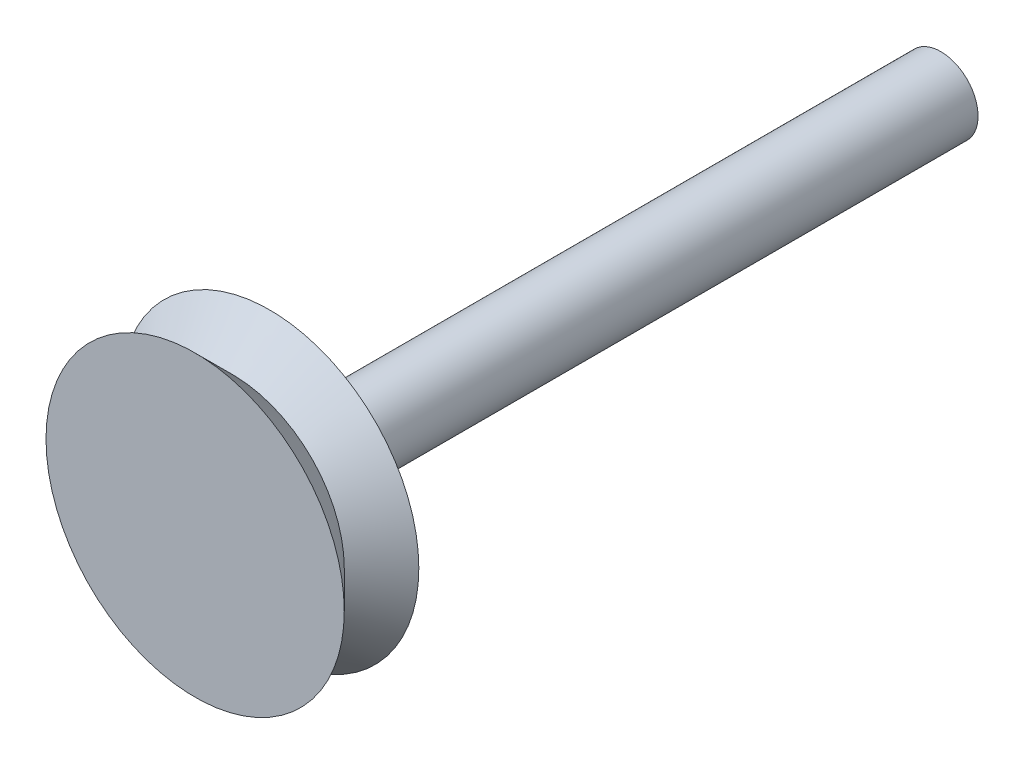
ISO-10303-21;
HEADER;
FILE_DESCRIPTION(('STEP AP214'),'2;1');
FILE_NAME('part.step','',(''),(''),'','','');
FILE_SCHEMA(('AUTOMOTIVE_DESIGN { 1 0 10303 214 1 1 1 1 }'));
ENDSEC;
DATA;
#1=APPLICATION_CONTEXT('core data for automotive mechanical design processes');
#2=APPLICATION_PROTOCOL_DEFINITION('international standard','automotive_design',2000,#1);
#3=PRODUCT_CONTEXT('',#1,'mechanical');
#4=PRODUCT('Part','Part','',(#3));
#5=PRODUCT_RELATED_PRODUCT_CATEGORY('part','',(#4));
#6=PRODUCT_DEFINITION_FORMATION('','',#4);
#7=PRODUCT_DEFINITION_CONTEXT('part definition',#1,'design');
#8=PRODUCT_DEFINITION('design','',#6,#7);
#9=PRODUCT_DEFINITION_SHAPE('','',#8);
#10=(LENGTH_UNIT() NAMED_UNIT(*) SI_UNIT(.MILLI.,.METRE.));
#11=(NAMED_UNIT(*) PLANE_ANGLE_UNIT() SI_UNIT($,.RADIAN.));
#12=(NAMED_UNIT(*) SI_UNIT($,.STERADIAN.) SOLID_ANGLE_UNIT());
#13=UNCERTAINTY_MEASURE_WITH_UNIT(LENGTH_MEASURE(1.E-05),#10,'distance_accuracy_value','');
#14=(GEOMETRIC_REPRESENTATION_CONTEXT(3) GLOBAL_UNCERTAINTY_ASSIGNED_CONTEXT((#13)) GLOBAL_UNIT_ASSIGNED_CONTEXT((#10,
#11,#12)) REPRESENTATION_CONTEXT('',''));
#15=CARTESIAN_POINT('',(0.,0.,0.));
#16=DIRECTION('',(0.,0.,1.));
#17=DIRECTION('',(1.,0.,0.));
#18=AXIS2_PLACEMENT_3D('',#15,#16,#17);
#19=CARTESIAN_POINT('',(0.,0.,0.));
#20=DIRECTION('',(0.,0.,1.));
#21=DIRECTION('',(1.,0.,0.));
#22=AXIS2_PLACEMENT_3D('',#19,#20,#21);
#23=PLANE('',#22);
#24=CARTESIAN_POINT('',(0.,0.,0.));
#25=DIRECTION('',(0.,0.,-1.));
#26=DIRECTION('',(-1.,0.,0.));
#27=AXIS2_PLACEMENT_3D('',#24,#25,#26);
#28=CIRCLE('',#27,1.);
#29=CARTESIAN_POINT('',(-1.,0.,0.));
#30=VERTEX_POINT('',#29);
#31=EDGE_CURVE('E10',#30,#30,#28,.T.);
#32=ORIENTED_EDGE('',*,*,#31,.F.);
#33=EDGE_LOOP('',(#32));
#34=FACE_BOUND('',#33,.T.);
#35=CARTESIAN_POINT('',(0.,0.,0.));
#36=DIRECTION('',(0.,0.,1.));
#37=DIRECTION('',(1.,0.,0.));
#38=AXIS2_PLACEMENT_3D('',#35,#36,#37);
#39=CIRCLE('',#38,4.);
#40=CARTESIAN_POINT('',(4.,0.,0.));
#41=VERTEX_POINT('',#40);
#42=EDGE_CURVE('E51',#41,#41,#39,.T.);
#43=ORIENTED_EDGE('',*,*,#42,.F.);
#44=EDGE_LOOP('',(#43));
#45=FACE_BOUND('',#44,.T.);
#46=ADVANCED_FACE('F32',(#34,#45),#23,.F.);
#47=CARTESIAN_POINT('',(0.,0.,-18.));
#48=DIRECTION('',(0.,0.,1.));
#49=DIRECTION('',(1.,0.,0.));
#50=AXIS2_PLACEMENT_3D('',#47,#48,#49);
#51=CYLINDRICAL_SURFACE('',#50,1.);
#52=CARTESIAN_POINT('',(0.,0.,-18.));
#53=DIRECTION('',(0.,0.,-1.));
#54=DIRECTION('',(-1.,0.,0.));
#55=AXIS2_PLACEMENT_3D('',#52,#53,#54);
#56=CIRCLE('',#55,1.);
#57=CARTESIAN_POINT('',(-1.,0.,-18.));
#58=VERTEX_POINT('',#57);
#59=EDGE_CURVE('E38',#58,#58,#56,.T.);
#60=ORIENTED_EDGE('',*,*,#59,.F.);
#61=EDGE_LOOP('',(#60));
#62=FACE_BOUND('',#61,.T.);
#63=ORIENTED_EDGE('',*,*,#31,.T.);
#64=EDGE_LOOP('',(#63));
#65=FACE_BOUND('',#64,.T.);
#66=ADVANCED_FACE('F59',(#62,#65),#51,.T.);
#67=CARTESIAN_POINT('',(0.,0.,-18.));
#68=DIRECTION('',(0.,0.,-1.));
#69=DIRECTION('',(-1.,0.,0.));
#70=AXIS2_PLACEMENT_3D('',#67,#68,#69);
#71=PLANE('',#70);
#72=ORIENTED_EDGE('',*,*,#59,.T.);
#73=EDGE_LOOP('',(#72));
#74=FACE_BOUND('',#73,.T.);
#75=ADVANCED_FACE('F64',(#74),#71,.T.);
#76=CARTESIAN_POINT('',(0.,0.,2.));
#77=DIRECTION('',(0.,0.,1.));
#78=DIRECTION('',(1.,0.,0.));
#79=AXIS2_PLACEMENT_3D('',#76,#77,#78);
#80=CONICAL_SURFACE('',#79,4.,0.78539816339745);
#81=CARTESIAN_POINT('',(0.,0.,1.));
#82=DIRECTION('',(0.,0.,1.));
#83=DIRECTION('',(1.,0.,0.));
#84=AXIS2_PLACEMENT_3D('',#81,#82,#83);
#85=CIRCLE('',#84,3.);
#86=CARTESIAN_POINT('',(3.,0.,1.));
#87=VERTEX_POINT('',#86);
#88=EDGE_CURVE('E46',#87,#87,#85,.T.);
#89=ORIENTED_EDGE('',*,*,#88,.T.);
#90=EDGE_LOOP('',(#89));
#91=FACE_BOUND('',#90,.T.);
#92=CARTESIAN_POINT('',(0.,0.,2.));
#93=DIRECTION('',(0.,0.,1.));
#94=DIRECTION('',(1.,0.,0.));
#95=AXIS2_PLACEMENT_3D('',#92,#93,#94);
#96=CIRCLE('',#95,4.);
#97=CARTESIAN_POINT('',(4.,0.,2.));
#98=VERTEX_POINT('',#97);
#99=EDGE_CURVE('E42',#98,#98,#96,.T.);
#100=ORIENTED_EDGE('',*,*,#99,.F.);
#101=EDGE_LOOP('',(#100));
#102=FACE_BOUND('',#101,.T.);
#103=ADVANCED_FACE('F70',(#91,#102),#80,.T.);
#104=CARTESIAN_POINT('',(0.,0.,1.));
#105=DIRECTION('',(0.,0.,-1.));
#106=DIRECTION('',(-1.,0.,0.));
#107=AXIS2_PLACEMENT_3D('',#104,#105,#106);
#108=CONICAL_SURFACE('',#107,3.,0.78539816339745);
#109=ORIENTED_EDGE('',*,*,#42,.T.);
#110=EDGE_LOOP('',(#109));
#111=FACE_BOUND('',#110,.T.);
#112=ORIENTED_EDGE('',*,*,#88,.F.);
#113=EDGE_LOOP('',(#112));
#114=FACE_BOUND('',#113,.T.);
#115=ADVANCED_FACE('F55',(#111,#114),#108,.T.);
#116=CARTESIAN_POINT('',(0.,0.,2.));
#117=DIRECTION('',(0.,0.,1.));
#118=DIRECTION('',(1.,0.,0.));
#119=AXIS2_PLACEMENT_3D('',#116,#117,#118);
#120=PLANE('',#119);
#121=ORIENTED_EDGE('',*,*,#99,.T.);
#122=EDGE_LOOP('',(#121));
#123=FACE_BOUND('',#122,.T.);
#124=ADVANCED_FACE('F73',(#123),#120,.T.);
#125=CLOSED_SHELL('',(#46,#66,#75,#103,#115,#124));
#126=MANIFOLD_SOLID_BREP('B2',#125);
#127=ADVANCED_BREP_SHAPE_REPRESENTATION('',(#18,#126),#14);
#128=SHAPE_DEFINITION_REPRESENTATION(#9,#127);
ENDSEC;
END-ISO-10303-21;
